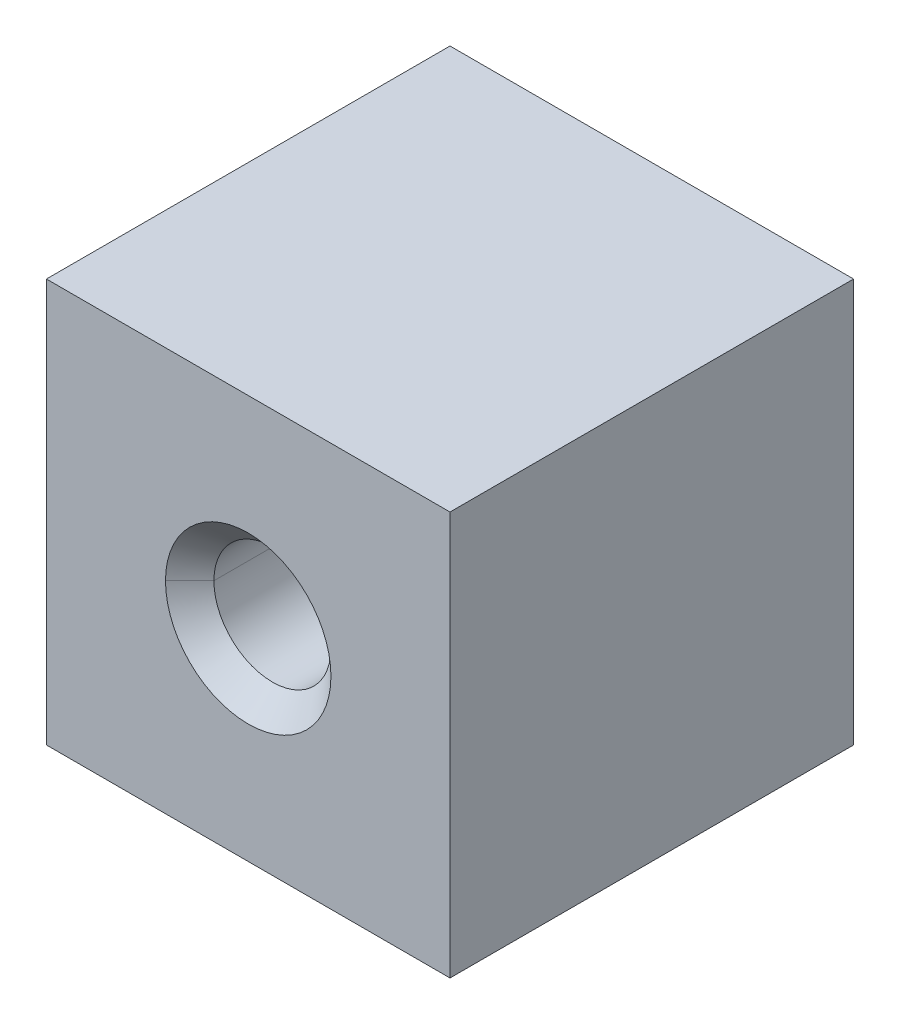
ISO-10303-21;
HEADER;
FILE_DESCRIPTION(('STEP AP214'),'2;1');
FILE_NAME('part.step','',(''),(''),'','','');
FILE_SCHEMA(('AUTOMOTIVE_DESIGN { 1 0 10303 214 1 1 1 1 }'));
ENDSEC;
DATA;
#1=APPLICATION_CONTEXT('core data for automotive mechanical design processes');
#2=APPLICATION_PROTOCOL_DEFINITION('international standard','automotive_design',2000,#1);
#3=PRODUCT_CONTEXT('',#1,'mechanical');
#4=PRODUCT('Part','Part','',(#3));
#5=PRODUCT_RELATED_PRODUCT_CATEGORY('part','',(#4));
#6=PRODUCT_DEFINITION_FORMATION('','',#4);
#7=PRODUCT_DEFINITION_CONTEXT('part definition',#1,'design');
#8=PRODUCT_DEFINITION('design','',#6,#7);
#9=PRODUCT_DEFINITION_SHAPE('','',#8);
#10=(LENGTH_UNIT() NAMED_UNIT(*) SI_UNIT(.MILLI.,.METRE.));
#11=(NAMED_UNIT(*) PLANE_ANGLE_UNIT() SI_UNIT($,.RADIAN.));
#12=(NAMED_UNIT(*) SI_UNIT($,.STERADIAN.) SOLID_ANGLE_UNIT());
#13=UNCERTAINTY_MEASURE_WITH_UNIT(LENGTH_MEASURE(1.E-05),#10,'distance_accuracy_value','');
#14=(GEOMETRIC_REPRESENTATION_CONTEXT(3) GLOBAL_UNCERTAINTY_ASSIGNED_CONTEXT((#13)) GLOBAL_UNIT_ASSIGNED_CONTEXT((#10,
#11,#12)) REPRESENTATION_CONTEXT('',''));
#15=CARTESIAN_POINT('',(0.,0.,0.));
#16=DIRECTION('',(0.,0.,1.));
#17=DIRECTION('',(1.,0.,0.));
#18=AXIS2_PLACEMENT_3D('',#15,#16,#17);
#19=CARTESIAN_POINT('',(0.,0.,0.));
#20=DIRECTION('',(0.,0.,-1.));
#21=DIRECTION('',(1.,0.,0.));
#22=AXIS2_PLACEMENT_3D('',#19,#20,#21);
#23=CYLINDRICAL_SURFACE('',#22,2.75);
#24=DIRECTION('',(0.,0.,1.));
#25=VECTOR('',#24,1.);
#26=CARTESIAN_POINT('',(2.75,0.,0.));
#27=LINE('',#26,#25);
#28=CARTESIAN_POINT('',(2.75,0.,0.));
#29=VERTEX_POINT('',#28);
#30=CARTESIAN_POINT('',(2.75,0.,6.5));
#31=VERTEX_POINT('',#30);
#32=EDGE_CURVE('E11',#29,#31,#27,.T.);
#33=ORIENTED_EDGE('',*,*,#32,.T.);
#34=CARTESIAN_POINT('',(0.,0.,6.5));
#35=DIRECTION('',(0.,0.,1.));
#36=DIRECTION('',(1.,0.,0.));
#37=AXIS2_PLACEMENT_3D('',#34,#35,#36);
#38=CIRCLE('',#37,2.75);
#39=CARTESIAN_POINT('',(-2.75,0.,6.5));
#40=VERTEX_POINT('',#39);
#41=EDGE_CURVE('E111',#31,#40,#38,.T.);
#42=ORIENTED_EDGE('',*,*,#41,.T.);
#43=DIRECTION('',(0.,0.,1.));
#44=VECTOR('',#43,1.);
#45=CARTESIAN_POINT('',(-2.75,0.,0.));
#46=LINE('',#45,#44);
#47=CARTESIAN_POINT('',(-2.75,0.,0.));
#48=VERTEX_POINT('',#47);
#49=EDGE_CURVE('E26',#48,#40,#46,.T.);
#50=ORIENTED_EDGE('',*,*,#49,.F.);
#51=CARTESIAN_POINT('',(0.,0.,0.));
#52=DIRECTION('',(0.,0.,-1.));
#53=DIRECTION('',(-1.,0.,0.));
#54=AXIS2_PLACEMENT_3D('',#51,#52,#53);
#55=CIRCLE('',#54,2.75);
#56=EDGE_CURVE('E109',#48,#29,#55,.T.);
#57=ORIENTED_EDGE('',*,*,#56,.T.);
#58=EDGE_LOOP('',(#33,#42,#50,#57));
#59=FACE_BOUND('',#58,.T.);
#60=ADVANCED_FACE('F17',(#59),#23,.F.);
#61=CARTESIAN_POINT('',(0.,0.,0.));
#62=DIRECTION('',(0.,0.,-1.));
#63=DIRECTION('',(1.,0.,0.));
#64=AXIS2_PLACEMENT_3D('',#61,#62,#63);
#65=CYLINDRICAL_SURFACE('',#64,2.75);
#66=ORIENTED_EDGE('',*,*,#49,.T.);
#67=CARTESIAN_POINT('',(0.,0.,6.5));
#68=DIRECTION('',(0.,0.,1.));
#69=DIRECTION('',(-1.,0.,0.));
#70=AXIS2_PLACEMENT_3D('',#67,#68,#69);
#71=CIRCLE('',#70,2.75);
#72=EDGE_CURVE('E113',#40,#31,#71,.T.);
#73=ORIENTED_EDGE('',*,*,#72,.T.);
#74=ORIENTED_EDGE('',*,*,#32,.F.);
#75=CARTESIAN_POINT('',(0.,0.,0.));
#76=DIRECTION('',(0.,0.,-1.));
#77=DIRECTION('',(1.,0.,0.));
#78=AXIS2_PLACEMENT_3D('',#75,#76,#77);
#79=CIRCLE('',#78,2.75);
#80=EDGE_CURVE('E115',#29,#48,#79,.T.);
#81=ORIENTED_EDGE('',*,*,#80,.T.);
#82=EDGE_LOOP('',(#66,#73,#74,#81));
#83=FACE_BOUND('',#82,.T.);
#84=ADVANCED_FACE('F116',(#83),#65,.F.);
#85=CARTESIAN_POINT('',(0.,0.,6.5));
#86=DIRECTION('',(0.,0.,-1.));
#87=DIRECTION('',(0.,-1.,0.));
#88=AXIS2_PLACEMENT_3D('',#85,#86,#87);
#89=PLANE('',#88);
#90=CARTESIAN_POINT('',(0.,0.,6.5));
#91=DIRECTION('',(0.,0.,1.));
#92=DIRECTION('',(1.,0.,0.));
#93=AXIS2_PLACEMENT_3D('',#90,#91,#92);
#94=CIRCLE('',#93,1.45);
#95=CARTESIAN_POINT('',(1.45,0.,6.5));
#96=VERTEX_POINT('',#95);
#97=CARTESIAN_POINT('',(-1.45,0.,6.5));
#98=VERTEX_POINT('',#97);
#99=EDGE_CURVE('E142',#96,#98,#94,.T.);
#100=ORIENTED_EDGE('',*,*,#99,.T.);
#101=CARTESIAN_POINT('',(0.,0.,6.5));
#102=DIRECTION('',(0.,0.,1.));
#103=DIRECTION('',(-1.,0.,0.));
#104=AXIS2_PLACEMENT_3D('',#101,#102,#103);
#105=CIRCLE('',#104,1.45);
#106=EDGE_CURVE('E186',#98,#96,#105,.T.);
#107=ORIENTED_EDGE('',*,*,#106,.T.);
#108=EDGE_LOOP('',(#100,#107));
#109=FACE_BOUND('',#108,.T.);
#110=ORIENTED_EDGE('',*,*,#41,.F.);
#111=ORIENTED_EDGE('',*,*,#72,.F.);
#112=EDGE_LOOP('',(#110,#111));
#113=FACE_BOUND('',#112,.T.);
#114=ADVANCED_FACE('F19',(#109,#113),#89,.T.);
#115=CARTESIAN_POINT('',(0.,0.,-3.514810292469));
#116=DIRECTION('',(0.,0.,1.));
#117=DIRECTION('',(-1.,0.,0.));
#118=AXIS2_PLACEMENT_3D('',#115,#116,#117);
#119=CYLINDRICAL_SURFACE('',#118,1.45);
#120=DIRECTION('',(7.467919004054E-11,2.863512471054E-11,1.));
#121=VECTOR('',#120,1.);
#122=CARTESIAN_POINT('',(-1.45,0.,6.5));
#123=LINE('',#122,#121);
#124=CARTESIAN_POINT('',(-1.45,0.,9.4));
#125=VERTEX_POINT('',#124);
#126=EDGE_CURVE('E145',#98,#125,#123,.T.);
#127=ORIENTED_EDGE('',*,*,#126,.F.);
#128=ORIENTED_EDGE('',*,*,#99,.F.);
#129=DIRECTION('',(-7.467919004054E-11,-2.863514142313E-11,1.));
#130=VECTOR('',#129,1.);
#131=CARTESIAN_POINT('',(1.45,0.,6.5));
#132=LINE('',#131,#130);
#133=CARTESIAN_POINT('',(1.45,0.,9.4));
#134=VERTEX_POINT('',#133);
#135=EDGE_CURVE('E183',#96,#134,#132,.T.);
#136=ORIENTED_EDGE('',*,*,#135,.T.);
#137=CARTESIAN_POINT('',(0.,0.,9.4));
#138=DIRECTION('',(0.,0.,-1.));
#139=DIRECTION('',(-1.,0.,0.));
#140=AXIS2_PLACEMENT_3D('',#137,#138,#139);
#141=CIRCLE('',#140,1.45);
#142=EDGE_CURVE('E169',#125,#134,#141,.T.);
#143=ORIENTED_EDGE('',*,*,#142,.F.);
#144=EDGE_LOOP('',(#127,#128,#136,#143));
#145=FACE_BOUND('',#144,.T.);
#146=ADVANCED_FACE('F196',(#145),#119,.F.);
#147=CARTESIAN_POINT('',(0.,0.,-3.514810292469));
#148=DIRECTION('',(0.,0.,1.));
#149=DIRECTION('',(-1.,0.,0.));
#150=AXIS2_PLACEMENT_3D('',#147,#148,#149);
#151=CYLINDRICAL_SURFACE('',#150,1.45);
#152=ORIENTED_EDGE('',*,*,#135,.F.);
#153=ORIENTED_EDGE('',*,*,#106,.F.);
#154=ORIENTED_EDGE('',*,*,#126,.T.);
#155=CARTESIAN_POINT('',(0.,0.,9.4));
#156=DIRECTION('',(0.,0.,-1.));
#157=DIRECTION('',(1.,0.,0.));
#158=AXIS2_PLACEMENT_3D('',#155,#156,#157);
#159=CIRCLE('',#158,1.45);
#160=EDGE_CURVE('E179',#134,#125,#159,.T.);
#161=ORIENTED_EDGE('',*,*,#160,.F.);
#162=EDGE_LOOP('',(#152,#153,#154,#161));
#163=FACE_BOUND('',#162,.T.);
#164=ADVANCED_FACE('F204',(#163),#151,.F.);
#165=CARTESIAN_POINT('',(0.,0.,9.699999999731));
#166=DIRECTION('',(0.,0.,1.));
#167=DIRECTION('',(0.,-1.,0.));
#168=AXIS2_PLACEMENT_3D('',#165,#166,#167);
#169=CONICAL_SURFACE('',#168,1.749999999731,0.7853981633973);
#170=DIRECTION('',(-0.707106781186548,8.66166195902858E-11,-0.707106781186548));
#171=VECTOR('',#170,1.);
#172=CARTESIAN_POINT('',(2.049999999592,-1.565386563098E-10,9.999999999592));
#173=LINE('',#172,#171);
#174=CARTESIAN_POINT('',(2.05,0.,10.));
#175=VERTEX_POINT('',#174);
#176=EDGE_CURVE('E173',#175,#134,#173,.T.);
#177=ORIENTED_EDGE('',*,*,#176,.T.);
#178=ORIENTED_EDGE('',*,*,#160,.T.);
#179=DIRECTION('',(0.707106781186548,-8.66167529638158E-11,-0.707106781186548));
#180=VECTOR('',#179,1.);
#181=CARTESIAN_POINT('',(-2.049999999592,1.56538613693E-10,9.999999999592));
#182=LINE('',#181,#180);
#183=CARTESIAN_POINT('',(-2.05,0.,10.));
#184=VERTEX_POINT('',#183);
#185=EDGE_CURVE('E162',#184,#125,#182,.T.);
#186=ORIENTED_EDGE('',*,*,#185,.F.);
#187=CARTESIAN_POINT('',(0.,0.,10.));
#188=DIRECTION('',(0.,0.,-1.));
#189=DIRECTION('',(1.,0.,0.));
#190=AXIS2_PLACEMENT_3D('',#187,#188,#189);
#191=CIRCLE('',#190,2.05);
#192=EDGE_CURVE('E163',#175,#184,#191,.T.);
#193=ORIENTED_EDGE('',*,*,#192,.F.);
#194=EDGE_LOOP('',(#177,#178,#186,#193));
#195=FACE_BOUND('',#194,.T.);
#196=ADVANCED_FACE('F220',(#195),#169,.F.);
#197=CARTESIAN_POINT('',(0.,0.,9.699999999731));
#198=DIRECTION('',(0.,0.,1.));
#199=DIRECTION('',(0.,-1.,0.));
#200=AXIS2_PLACEMENT_3D('',#197,#198,#199);
#201=CONICAL_SURFACE('',#200,1.749999999731,0.7853981633973);
#202=ORIENTED_EDGE('',*,*,#185,.T.);
#203=ORIENTED_EDGE('',*,*,#142,.T.);
#204=ORIENTED_EDGE('',*,*,#176,.F.);
#205=CARTESIAN_POINT('',(0.,0.,10.));
#206=DIRECTION('',(0.,0.,-1.));
#207=DIRECTION('',(-1.,0.,0.));
#208=AXIS2_PLACEMENT_3D('',#205,#206,#207);
#209=CIRCLE('',#208,2.05);
#210=EDGE_CURVE('E158',#184,#175,#209,.T.);
#211=ORIENTED_EDGE('',*,*,#210,.F.);
#212=EDGE_LOOP('',(#202,#203,#204,#211));
#213=FACE_BOUND('',#212,.T.);
#214=ADVANCED_FACE('F223',(#213),#201,.F.);
#215=CARTESIAN_POINT('',(0.,0.,10.));
#216=DIRECTION('',(0.,0.,1.));
#217=DIRECTION('',(1.,0.,0.));
#218=AXIS2_PLACEMENT_3D('',#215,#216,#217);
#219=PLANE('',#218);
#220=ORIENTED_EDGE('',*,*,#192,.T.);
#221=ORIENTED_EDGE('',*,*,#210,.T.);
#222=EDGE_LOOP('',(#220,#221));
#223=FACE_BOUND('',#222,.T.);
#224=DIRECTION('',(1.,0.,0.));
#225=VECTOR('',#224,1.);
#226=CARTESIAN_POINT('',(-5.,-5.,10.));
#227=LINE('',#226,#225);
#228=CARTESIAN_POINT('',(-5.,-5.,10.));
#229=VERTEX_POINT('',#228);
#230=CARTESIAN_POINT('',(5.,-5.,10.));
#231=VERTEX_POINT('',#230);
#232=EDGE_CURVE('E136',#229,#231,#227,.T.);
#233=ORIENTED_EDGE('',*,*,#232,.T.);
#234=DIRECTION('',(0.,1.,0.));
#235=VECTOR('',#234,1.);
#236=CARTESIAN_POINT('',(5.,-5.,10.));
#237=LINE('',#236,#235);
#238=CARTESIAN_POINT('',(5.,5.,10.));
#239=VERTEX_POINT('',#238);
#240=EDGE_CURVE('E137',#231,#239,#237,.T.);
#241=ORIENTED_EDGE('',*,*,#240,.T.);
#242=DIRECTION('',(-1.,0.,0.));
#243=VECTOR('',#242,1.);
#244=CARTESIAN_POINT('',(5.,5.,10.));
#245=LINE('',#244,#243);
#246=CARTESIAN_POINT('',(-5.,5.,10.));
#247=VERTEX_POINT('',#246);
#248=EDGE_CURVE('E154',#239,#247,#245,.T.);
#249=ORIENTED_EDGE('',*,*,#248,.T.);
#250=DIRECTION('',(0.,-1.,0.));
#251=VECTOR('',#250,1.);
#252=CARTESIAN_POINT('',(-5.,5.,10.));
#253=LINE('',#252,#251);
#254=EDGE_CURVE('E146',#247,#229,#253,.T.);
#255=ORIENTED_EDGE('',*,*,#254,.T.);
#256=EDGE_LOOP('',(#233,#241,#249,#255));
#257=FACE_BOUND('',#256,.T.);
#258=ADVANCED_FACE('F235',(#223,#257),#219,.T.);
#259=CARTESIAN_POINT('',(-5.,-5.,0.));
#260=DIRECTION('',(0.,-1.,0.));
#261=DIRECTION('',(0.,0.,-1.));
#262=AXIS2_PLACEMENT_3D('',#259,#260,#261);
#263=PLANE('',#262);
#264=DIRECTION('',(0.,0.,1.));
#265=VECTOR('',#264,1.);
#266=CARTESIAN_POINT('',(5.,-5.,0.));
#267=LINE('',#266,#265);
#268=CARTESIAN_POINT('',(5.,-5.,0.));
#269=VERTEX_POINT('',#268);
#270=EDGE_CURVE('E134',#269,#231,#267,.T.);
#271=ORIENTED_EDGE('',*,*,#270,.T.);
#272=ORIENTED_EDGE('',*,*,#232,.F.);
#273=DIRECTION('',(0.,0.,1.));
#274=VECTOR('',#273,1.);
#275=CARTESIAN_POINT('',(-5.,-5.,0.));
#276=LINE('',#275,#274);
#277=CARTESIAN_POINT('',(-5.,-5.,0.));
#278=VERTEX_POINT('',#277);
#279=EDGE_CURVE('E119',#278,#229,#276,.T.);
#280=ORIENTED_EDGE('',*,*,#279,.F.);
#281=DIRECTION('',(1.,0.,0.));
#282=VECTOR('',#281,1.);
#283=CARTESIAN_POINT('',(-5.,-5.,0.));
#284=LINE('',#283,#282);
#285=EDGE_CURVE('E130',#278,#269,#284,.T.);
#286=ORIENTED_EDGE('',*,*,#285,.T.);
#287=EDGE_LOOP('',(#271,#272,#280,#286));
#288=FACE_BOUND('',#287,.T.);
#289=ADVANCED_FACE('F231',(#288),#263,.T.);
#290=CARTESIAN_POINT('',(5.,-5.,0.));
#291=DIRECTION('',(1.,0.,0.));
#292=DIRECTION('',(0.,1.,0.));
#293=AXIS2_PLACEMENT_3D('',#290,#291,#292);
#294=PLANE('',#293);
#295=DIRECTION('',(0.,0.,1.));
#296=VECTOR('',#295,1.);
#297=CARTESIAN_POINT('',(5.,5.,0.));
#298=LINE('',#297,#296);
#299=CARTESIAN_POINT('',(5.,5.,0.));
#300=VERTEX_POINT('',#299);
#301=EDGE_CURVE('E141',#300,#239,#298,.T.);
#302=ORIENTED_EDGE('',*,*,#301,.T.);
#303=ORIENTED_EDGE('',*,*,#240,.F.);
#304=ORIENTED_EDGE('',*,*,#270,.F.);
#305=DIRECTION('',(0.,1.,0.));
#306=VECTOR('',#305,1.);
#307=CARTESIAN_POINT('',(5.,-5.,0.));
#308=LINE('',#307,#306);
#309=EDGE_CURVE('E267',#269,#300,#308,.T.);
#310=ORIENTED_EDGE('',*,*,#309,.T.);
#311=EDGE_LOOP('',(#302,#303,#304,#310));
#312=FACE_BOUND('',#311,.T.);
#313=ADVANCED_FACE('F227',(#312),#294,.T.);
#314=CARTESIAN_POINT('',(5.,5.,0.));
#315=DIRECTION('',(0.,1.,0.));
#316=DIRECTION('',(1.,0.,0.));
#317=AXIS2_PLACEMENT_3D('',#314,#315,#316);
#318=PLANE('',#317);
#319=DIRECTION('',(0.,0.,1.));
#320=VECTOR('',#319,1.);
#321=CARTESIAN_POINT('',(-5.,5.,0.));
#322=LINE('',#321,#320);
#323=CARTESIAN_POINT('',(-5.,5.,0.));
#324=VERTEX_POINT('',#323);
#325=EDGE_CURVE('E150',#324,#247,#322,.T.);
#326=ORIENTED_EDGE('',*,*,#325,.T.);
#327=ORIENTED_EDGE('',*,*,#248,.F.);
#328=ORIENTED_EDGE('',*,*,#301,.F.);
#329=DIRECTION('',(-1.,0.,0.));
#330=VECTOR('',#329,1.);
#331=CARTESIAN_POINT('',(5.,5.,0.));
#332=LINE('',#331,#330);
#333=EDGE_CURVE('E264',#300,#324,#332,.T.);
#334=ORIENTED_EDGE('',*,*,#333,.T.);
#335=EDGE_LOOP('',(#326,#327,#328,#334));
#336=FACE_BOUND('',#335,.T.);
#337=ADVANCED_FACE('F218',(#336),#318,.T.);
#338=CARTESIAN_POINT('',(-5.,5.,0.));
#339=DIRECTION('',(-1.,0.,0.));
#340=DIRECTION('',(0.,0.,1.));
#341=AXIS2_PLACEMENT_3D('',#338,#339,#340);
#342=PLANE('',#341);
#343=ORIENTED_EDGE('',*,*,#279,.T.);
#344=ORIENTED_EDGE('',*,*,#254,.F.);
#345=ORIENTED_EDGE('',*,*,#325,.F.);
#346=DIRECTION('',(0.,-1.,0.));
#347=VECTOR('',#346,1.);
#348=CARTESIAN_POINT('',(-5.,5.,0.));
#349=LINE('',#348,#347);
#350=EDGE_CURVE('E124',#324,#278,#349,.T.);
#351=ORIENTED_EDGE('',*,*,#350,.T.);
#352=EDGE_LOOP('',(#343,#344,#345,#351));
#353=FACE_BOUND('',#352,.T.);
#354=ADVANCED_FACE('F214',(#353),#342,.T.);
#355=CARTESIAN_POINT('',(0.,0.,0.));
#356=DIRECTION('',(0.,0.,1.));
#357=DIRECTION('',(1.,0.,0.));
#358=AXIS2_PLACEMENT_3D('',#355,#356,#357);
#359=PLANE('',#358);
#360=ORIENTED_EDGE('',*,*,#56,.F.);
#361=ORIENTED_EDGE('',*,*,#80,.F.);
#362=EDGE_LOOP('',(#360,#361));
#363=FACE_BOUND('',#362,.T.);
#364=ORIENTED_EDGE('',*,*,#333,.F.);
#365=ORIENTED_EDGE('',*,*,#309,.F.);
#366=ORIENTED_EDGE('',*,*,#285,.F.);
#367=ORIENTED_EDGE('',*,*,#350,.F.);
#368=EDGE_LOOP('',(#364,#365,#366,#367));
#369=FACE_BOUND('',#368,.T.);
#370=ADVANCED_FACE('F121',(#363,#369),#359,.F.);
#371=CLOSED_SHELL('',(#60,#84,#114,#146,#164,#196,#214,#258,#289,#313,#337,#354,#370));
#372=MANIFOLD_SOLID_BREP('B1',#371);
#373=ADVANCED_BREP_SHAPE_REPRESENTATION('',(#18,#372),#14);
#374=SHAPE_DEFINITION_REPRESENTATION(#9,#373);
ENDSEC;
END-ISO-10303-21;
